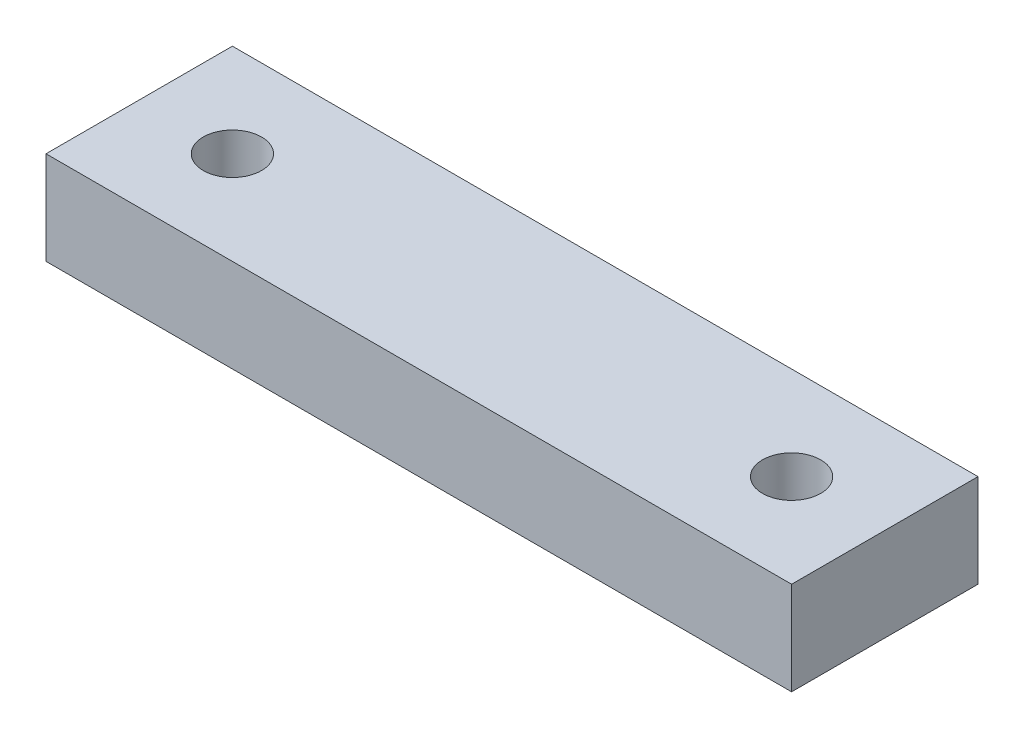
ISO-10303-21;
HEADER;
FILE_DESCRIPTION(('STEP AP214'),'2;1');
FILE_NAME('part.step','',(''),(''),'','','');
FILE_SCHEMA(('AUTOMOTIVE_DESIGN { 1 0 10303 214 1 1 1 1 }'));
ENDSEC;
DATA;
#1=APPLICATION_CONTEXT('core data for automotive mechanical design processes');
#2=APPLICATION_PROTOCOL_DEFINITION('international standard','automotive_design',2000,#1);
#3=PRODUCT_CONTEXT('',#1,'mechanical');
#4=PRODUCT('Part','Part','',(#3));
#5=PRODUCT_RELATED_PRODUCT_CATEGORY('part','',(#4));
#6=PRODUCT_DEFINITION_FORMATION('','',#4);
#7=PRODUCT_DEFINITION_CONTEXT('part definition',#1,'design');
#8=PRODUCT_DEFINITION('design','',#6,#7);
#9=PRODUCT_DEFINITION_SHAPE('','',#8);
#10=(LENGTH_UNIT() NAMED_UNIT(*) SI_UNIT(.MILLI.,.METRE.));
#11=(NAMED_UNIT(*) PLANE_ANGLE_UNIT() SI_UNIT($,.RADIAN.));
#12=(NAMED_UNIT(*) SI_UNIT($,.STERADIAN.) SOLID_ANGLE_UNIT());
#13=UNCERTAINTY_MEASURE_WITH_UNIT(LENGTH_MEASURE(1.E-05),#10,'distance_accuracy_value','');
#14=(GEOMETRIC_REPRESENTATION_CONTEXT(3) GLOBAL_UNCERTAINTY_ASSIGNED_CONTEXT((#13)) GLOBAL_UNIT_ASSIGNED_CONTEXT((#10,
#11,#12)) REPRESENTATION_CONTEXT('',''));
#15=CARTESIAN_POINT('',(0.,0.,0.));
#16=DIRECTION('',(0.,0.,1.));
#17=DIRECTION('',(1.,0.,0.));
#18=AXIS2_PLACEMENT_3D('',#15,#16,#17);
#19=CARTESIAN_POINT('',(0.,4.,0.));
#20=DIRECTION('',(0.,-1.,0.));
#21=DIRECTION('',(0.,0.,-1.));
#22=AXIS2_PLACEMENT_3D('',#19,#20,#21);
#23=PLANE('',#22);
#24=DIRECTION('',(0.,0.,1.));
#25=VECTOR('',#24,1.);
#26=CARTESIAN_POINT('',(0.,4.,0.));
#27=LINE('',#26,#25);
#28=CARTESIAN_POINT('',(0.,4.,-8.));
#29=VERTEX_POINT('',#28);
#30=CARTESIAN_POINT('',(0.,4.,0.));
#31=VERTEX_POINT('',#30);
#32=EDGE_CURVE('E87',#29,#31,#27,.T.);
#33=ORIENTED_EDGE('',*,*,#32,.T.);
#34=DIRECTION('',(1.,0.,0.));
#35=VECTOR('',#34,1.);
#36=CARTESIAN_POINT('',(0.,4.,0.));
#37=LINE('',#36,#35);
#38=CARTESIAN_POINT('',(32.,4.,0.));
#39=VERTEX_POINT('',#38);
#40=EDGE_CURVE('E82',#31,#39,#37,.T.);
#41=ORIENTED_EDGE('',*,*,#40,.T.);
#42=DIRECTION('',(0.,0.,-1.));
#43=VECTOR('',#42,1.);
#44=CARTESIAN_POINT('',(32.,4.,0.));
#45=LINE('',#44,#43);
#46=CARTESIAN_POINT('',(32.,4.,-8.));
#47=VERTEX_POINT('',#46);
#48=EDGE_CURVE('E85',#39,#47,#45,.T.);
#49=ORIENTED_EDGE('',*,*,#48,.T.);
#50=DIRECTION('',(-1.,0.,0.));
#51=VECTOR('',#50,1.);
#52=CARTESIAN_POINT('',(0.,4.,-8.));
#53=LINE('',#52,#51);
#54=EDGE_CURVE('E52',#47,#29,#53,.T.);
#55=ORIENTED_EDGE('',*,*,#54,.T.);
#56=EDGE_LOOP('',(#33,#41,#49,#55));
#57=FACE_BOUND('',#56,.T.);
#58=CARTESIAN_POINT('',(4.,4.,-4.));
#59=DIRECTION('',(0.,1.,0.));
#60=DIRECTION('',(0.,0.,1.));
#61=AXIS2_PLACEMENT_3D('',#58,#59,#60);
#62=CIRCLE('',#61,1.25);
#63=CARTESIAN_POINT('',(4.,4.,-2.75));
#64=VERTEX_POINT('',#63);
#65=EDGE_CURVE('E102',#64,#64,#62,.T.);
#66=ORIENTED_EDGE('',*,*,#65,.F.);
#67=EDGE_LOOP('',(#66));
#68=FACE_BOUND('',#67,.T.);
#69=CARTESIAN_POINT('',(28.,4.,-4.));
#70=DIRECTION('',(0.,1.,0.));
#71=DIRECTION('',(0.,0.,-1.));
#72=AXIS2_PLACEMENT_3D('',#69,#70,#71);
#73=CIRCLE('',#72,1.25);
#74=CARTESIAN_POINT('',(28.,4.,-5.25));
#75=VERTEX_POINT('',#74);
#76=EDGE_CURVE('E117',#75,#75,#73,.T.);
#77=ORIENTED_EDGE('',*,*,#76,.F.);
#78=EDGE_LOOP('',(#77));
#79=FACE_BOUND('',#78,.T.);
#80=ADVANCED_FACE('F35',(#57,#68,#79),#23,.F.);
#81=CARTESIAN_POINT('',(0.,0.,0.));
#82=DIRECTION('',(0.,-1.,0.));
#83=DIRECTION('',(0.,0.,-1.));
#84=AXIS2_PLACEMENT_3D('',#81,#82,#83);
#85=PLANE('',#84);
#86=CARTESIAN_POINT('',(4.,0.,-4.));
#87=DIRECTION('',(0.,1.,0.));
#88=DIRECTION('',(0.,0.,1.));
#89=AXIS2_PLACEMENT_3D('',#86,#87,#88);
#90=CIRCLE('',#89,1.25);
#91=CARTESIAN_POINT('',(4.,0.,-2.75));
#92=VERTEX_POINT('',#91);
#93=EDGE_CURVE('E114',#92,#92,#90,.T.);
#94=ORIENTED_EDGE('',*,*,#93,.T.);
#95=EDGE_LOOP('',(#94));
#96=FACE_BOUND('',#95,.T.);
#97=DIRECTION('',(0.,0.,1.));
#98=VECTOR('',#97,1.);
#99=CARTESIAN_POINT('',(0.,0.,0.));
#100=LINE('',#99,#98);
#101=CARTESIAN_POINT('',(0.,0.,-8.));
#102=VERTEX_POINT('',#101);
#103=CARTESIAN_POINT('',(0.,0.,0.));
#104=VERTEX_POINT('',#103);
#105=EDGE_CURVE('E99',#102,#104,#100,.T.);
#106=ORIENTED_EDGE('',*,*,#105,.F.);
#107=DIRECTION('',(-1.,0.,0.));
#108=VECTOR('',#107,1.);
#109=CARTESIAN_POINT('',(0.,0.,-8.));
#110=LINE('',#109,#108);
#111=CARTESIAN_POINT('',(32.,0.,-8.));
#112=VERTEX_POINT('',#111);
#113=EDGE_CURVE('E75',#112,#102,#110,.T.);
#114=ORIENTED_EDGE('',*,*,#113,.F.);
#115=DIRECTION('',(0.,0.,-1.));
#116=VECTOR('',#115,1.);
#117=CARTESIAN_POINT('',(32.,0.,0.));
#118=LINE('',#117,#116);
#119=CARTESIAN_POINT('',(32.,0.,0.));
#120=VERTEX_POINT('',#119);
#121=EDGE_CURVE('E69',#120,#112,#118,.T.);
#122=ORIENTED_EDGE('',*,*,#121,.F.);
#123=DIRECTION('',(1.,0.,0.));
#124=VECTOR('',#123,1.);
#125=CARTESIAN_POINT('',(0.,0.,0.));
#126=LINE('',#125,#124);
#127=EDGE_CURVE('E91',#104,#120,#126,.T.);
#128=ORIENTED_EDGE('',*,*,#127,.F.);
#129=EDGE_LOOP('',(#106,#114,#122,#128));
#130=FACE_BOUND('',#129,.T.);
#131=CARTESIAN_POINT('',(28.,0.,-4.));
#132=DIRECTION('',(0.,1.,0.));
#133=DIRECTION('',(0.,0.,-1.));
#134=AXIS2_PLACEMENT_3D('',#131,#132,#133);
#135=CIRCLE('',#134,1.25);
#136=CARTESIAN_POINT('',(28.,0.,-5.25));
#137=VERTEX_POINT('',#136);
#138=EDGE_CURVE('E120',#137,#137,#135,.T.);
#139=ORIENTED_EDGE('',*,*,#138,.T.);
#140=EDGE_LOOP('',(#139));
#141=FACE_BOUND('',#140,.T.);
#142=ADVANCED_FACE('F110',(#96,#130,#141),#85,.T.);
#143=CARTESIAN_POINT('',(0.,4.,0.));
#144=DIRECTION('',(1.,0.,0.));
#145=DIRECTION('',(0.,0.,-1.));
#146=AXIS2_PLACEMENT_3D('',#143,#144,#145);
#147=PLANE('',#146);
#148=ORIENTED_EDGE('',*,*,#105,.T.);
#149=DIRECTION('',(0.,-1.,0.));
#150=VECTOR('',#149,1.);
#151=CARTESIAN_POINT('',(0.,4.,0.));
#152=LINE('',#151,#150);
#153=EDGE_CURVE('E11',#31,#104,#152,.T.);
#154=ORIENTED_EDGE('',*,*,#153,.F.);
#155=ORIENTED_EDGE('',*,*,#32,.F.);
#156=DIRECTION('',(0.,-1.,0.));
#157=VECTOR('',#156,1.);
#158=CARTESIAN_POINT('',(0.,4.,-8.));
#159=LINE('',#158,#157);
#160=EDGE_CURVE('E95',#29,#102,#159,.T.);
#161=ORIENTED_EDGE('',*,*,#160,.T.);
#162=EDGE_LOOP('',(#148,#154,#155,#161));
#163=FACE_BOUND('',#162,.T.);
#164=ADVANCED_FACE('F37',(#163),#147,.F.);
#165=CARTESIAN_POINT('',(0.,4.,0.));
#166=DIRECTION('',(0.,0.,-1.));
#167=DIRECTION('',(-1.,0.,0.));
#168=AXIS2_PLACEMENT_3D('',#165,#166,#167);
#169=PLANE('',#168);
#170=ORIENTED_EDGE('',*,*,#127,.T.);
#171=DIRECTION('',(0.,-1.,0.));
#172=VECTOR('',#171,1.);
#173=CARTESIAN_POINT('',(32.,4.,0.));
#174=LINE('',#173,#172);
#175=EDGE_CURVE('E44',#39,#120,#174,.T.);
#176=ORIENTED_EDGE('',*,*,#175,.F.);
#177=ORIENTED_EDGE('',*,*,#40,.F.);
#178=ORIENTED_EDGE('',*,*,#153,.T.);
#179=EDGE_LOOP('',(#170,#176,#177,#178));
#180=FACE_BOUND('',#179,.T.);
#181=ADVANCED_FACE('F90',(#180),#169,.F.);
#182=CARTESIAN_POINT('',(32.,4.,0.));
#183=DIRECTION('',(-1.,0.,0.));
#184=DIRECTION('',(0.,0.,1.));
#185=AXIS2_PLACEMENT_3D('',#182,#183,#184);
#186=PLANE('',#185);
#187=ORIENTED_EDGE('',*,*,#121,.T.);
#188=DIRECTION('',(0.,-1.,0.));
#189=VECTOR('',#188,1.);
#190=CARTESIAN_POINT('',(32.,4.,-8.));
#191=LINE('',#190,#189);
#192=EDGE_CURVE('E92',#47,#112,#191,.T.);
#193=ORIENTED_EDGE('',*,*,#192,.F.);
#194=ORIENTED_EDGE('',*,*,#48,.F.);
#195=ORIENTED_EDGE('',*,*,#175,.T.);
#196=EDGE_LOOP('',(#187,#193,#194,#195));
#197=FACE_BOUND('',#196,.T.);
#198=ADVANCED_FACE('F93',(#197),#186,.F.);
#199=CARTESIAN_POINT('',(0.,4.,-8.));
#200=DIRECTION('',(0.,0.,1.));
#201=DIRECTION('',(1.,0.,0.));
#202=AXIS2_PLACEMENT_3D('',#199,#200,#201);
#203=PLANE('',#202);
#204=ORIENTED_EDGE('',*,*,#113,.T.);
#205=ORIENTED_EDGE('',*,*,#160,.F.);
#206=ORIENTED_EDGE('',*,*,#54,.F.);
#207=ORIENTED_EDGE('',*,*,#192,.T.);
#208=EDGE_LOOP('',(#204,#205,#206,#207));
#209=FACE_BOUND('',#208,.T.);
#210=ADVANCED_FACE('F107',(#209),#203,.F.);
#211=CARTESIAN_POINT('',(4.,4.,-4.));
#212=DIRECTION('',(0.,-1.,0.));
#213=DIRECTION('',(0.,0.,-1.));
#214=AXIS2_PLACEMENT_3D('',#211,#212,#213);
#215=CYLINDRICAL_SURFACE('',#214,1.25);
#216=ORIENTED_EDGE('',*,*,#65,.T.);
#217=EDGE_LOOP('',(#216));
#218=FACE_BOUND('',#217,.T.);
#219=ORIENTED_EDGE('',*,*,#93,.F.);
#220=EDGE_LOOP('',(#219));
#221=FACE_BOUND('',#220,.T.);
#222=ADVANCED_FACE('F137',(#218,#221),#215,.F.);
#223=CARTESIAN_POINT('',(28.,4.,-4.));
#224=DIRECTION('',(0.,-1.,0.));
#225=DIRECTION('',(0.,0.,-1.));
#226=AXIS2_PLACEMENT_3D('',#223,#224,#225);
#227=CYLINDRICAL_SURFACE('',#226,1.25);
#228=ORIENTED_EDGE('',*,*,#76,.T.);
#229=EDGE_LOOP('',(#228));
#230=FACE_BOUND('',#229,.T.);
#231=ORIENTED_EDGE('',*,*,#138,.F.);
#232=EDGE_LOOP('',(#231));
#233=FACE_BOUND('',#232,.T.);
#234=ADVANCED_FACE('F126',(#230,#233),#227,.F.);
#235=CLOSED_SHELL('',(#80,#142,#164,#181,#198,#210,#222,#234));
#236=MANIFOLD_SOLID_BREP('B2',#235);
#237=ADVANCED_BREP_SHAPE_REPRESENTATION('',(#18,#236),#14);
#238=SHAPE_DEFINITION_REPRESENTATION(#9,#237);
ENDSEC;
END-ISO-10303-21;
